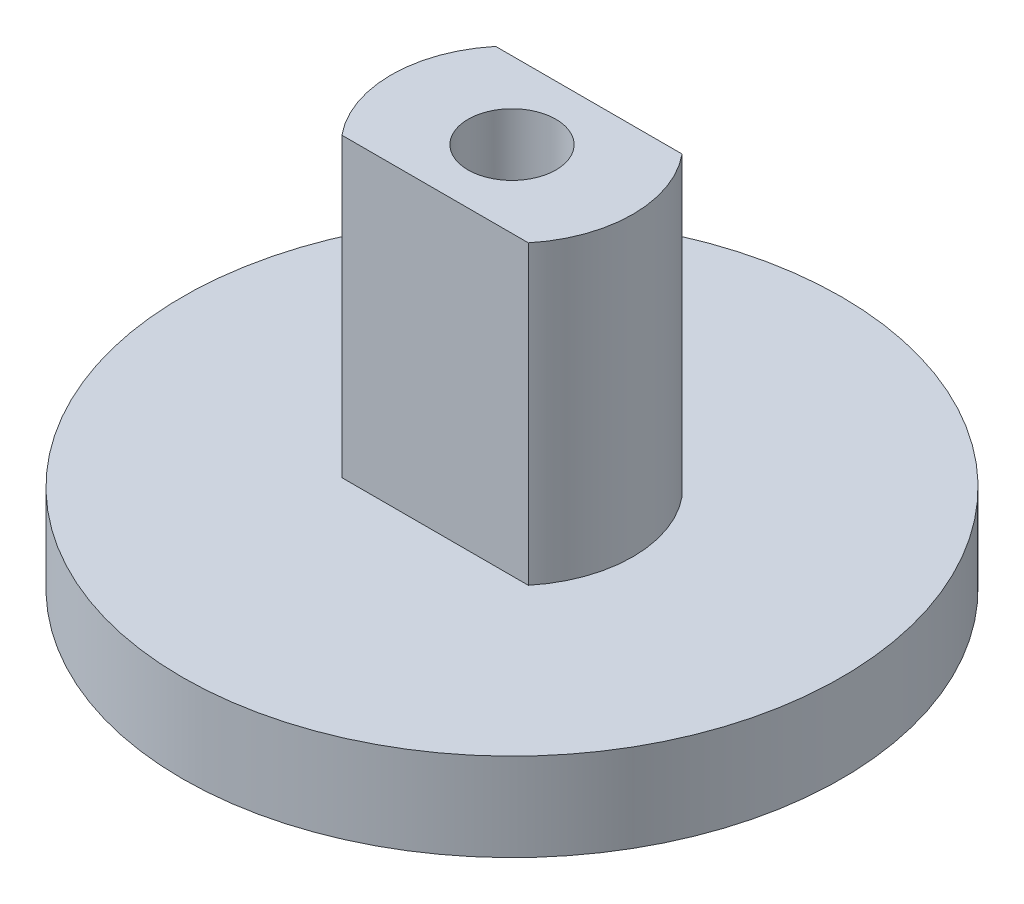
ISO-10303-21;
HEADER;
FILE_DESCRIPTION(('STEP AP214'),'2;1');
FILE_NAME('part.step','',(''),(''),'','','');
FILE_SCHEMA(('AUTOMOTIVE_DESIGN { 1 0 10303 214 1 1 1 1 }'));
ENDSEC;
DATA;
#1=APPLICATION_CONTEXT('core data for automotive mechanical design processes');
#2=APPLICATION_PROTOCOL_DEFINITION('international standard','automotive_design',2000,#1);
#3=PRODUCT_CONTEXT('',#1,'mechanical');
#4=PRODUCT('Part','Part','',(#3));
#5=PRODUCT_RELATED_PRODUCT_CATEGORY('part','',(#4));
#6=PRODUCT_DEFINITION_FORMATION('','',#4);
#7=PRODUCT_DEFINITION_CONTEXT('part definition',#1,'design');
#8=PRODUCT_DEFINITION('design','',#6,#7);
#9=PRODUCT_DEFINITION_SHAPE('','',#8);
#10=(LENGTH_UNIT() NAMED_UNIT(*) SI_UNIT(.MILLI.,.METRE.));
#11=(NAMED_UNIT(*) PLANE_ANGLE_UNIT() SI_UNIT($,.RADIAN.));
#12=(NAMED_UNIT(*) SI_UNIT($,.STERADIAN.) SOLID_ANGLE_UNIT());
#13=UNCERTAINTY_MEASURE_WITH_UNIT(LENGTH_MEASURE(1.E-05),#10,'distance_accuracy_value','');
#14=(GEOMETRIC_REPRESENTATION_CONTEXT(3) GLOBAL_UNCERTAINTY_ASSIGNED_CONTEXT((#13)) GLOBAL_UNIT_ASSIGNED_CONTEXT((#10,
#11,#12)) REPRESENTATION_CONTEXT('',''));
#15=CARTESIAN_POINT('',(0.,0.,0.));
#16=DIRECTION('',(0.,0.,1.));
#17=DIRECTION('',(1.,0.,0.));
#18=AXIS2_PLACEMENT_3D('',#15,#16,#17);
#19=CARTESIAN_POINT('',(0.,-6.,0.));
#20=DIRECTION('',(0.,1.,0.));
#21=DIRECTION('',(0.,0.,1.));
#22=AXIS2_PLACEMENT_3D('',#19,#20,#21);
#23=CYLINDRICAL_SURFACE('',#22,1.);
#24=CARTESIAN_POINT('',(0.,17.,0.));
#25=DIRECTION('',(0.,1.,0.));
#26=DIRECTION('',(0.,0.,1.));
#27=AXIS2_PLACEMENT_3D('',#24,#25,#26);
#28=CIRCLE('',#27,1.);
#29=CARTESIAN_POINT('',(0.,17.,1.));
#30=VERTEX_POINT('',#29);
#31=EDGE_CURVE('E99',#30,#30,#28,.F.);
#32=ORIENTED_EDGE('',*,*,#31,.T.);
#33=EDGE_LOOP('',(#32));
#34=FACE_BOUND('',#33,.T.);
#35=CARTESIAN_POINT('',(0.,24.,0.));
#36=DIRECTION('',(0.,-1.,0.));
#37=DIRECTION('',(0.,0.,-1.));
#38=AXIS2_PLACEMENT_3D('',#35,#36,#37);
#39=CIRCLE('',#38,1.);
#40=CARTESIAN_POINT('',(0.,24.,-1.));
#41=VERTEX_POINT('',#40);
#42=EDGE_CURVE('E102',#41,#41,#39,.T.);
#43=ORIENTED_EDGE('',*,*,#42,.F.);
#44=EDGE_LOOP('',(#43));
#45=FACE_BOUND('',#44,.T.);
#46=ADVANCED_FACE('F33',(#34,#45),#23,.F.);
#47=CARTESIAN_POINT('',(0.,24.,0.));
#48=DIRECTION('',(0.,-1.,0.));
#49=DIRECTION('',(0.,0.,-1.));
#50=AXIS2_PLACEMENT_3D('',#47,#48,#49);
#51=CYLINDRICAL_SURFACE('',#50,2.75000000000005);
#52=DIRECTION('',(0.,-1.,0.));
#53=VECTOR('',#52,1.);
#54=CARTESIAN_POINT('',(-2.12132034355971,24.,-1.75));
#55=LINE('',#54,#53);
#56=CARTESIAN_POINT('',(-2.12132034355971,24.,-1.75));
#57=VERTEX_POINT('',#56);
#58=CARTESIAN_POINT('',(-2.12132034355971,17.25,-1.75));
#59=VERTEX_POINT('',#58);
#60=EDGE_CURVE('E37',#57,#59,#55,.T.);
#61=ORIENTED_EDGE('',*,*,#60,.T.);
#62=CARTESIAN_POINT('',(0.,17.25,0.));
#63=DIRECTION('',(0.,1.,0.));
#64=DIRECTION('',(0.,0.,1.));
#65=AXIS2_PLACEMENT_3D('',#62,#63,#64);
#66=CIRCLE('',#65,2.75000000000005);
#67=CARTESIAN_POINT('',(-2.12132034355971,17.25,1.75));
#68=VERTEX_POINT('',#67);
#69=EDGE_CURVE('E79',#68,#59,#66,.F.);
#70=ORIENTED_EDGE('',*,*,#69,.F.);
#71=DIRECTION('',(0.,-1.,0.));
#72=VECTOR('',#71,1.);
#73=CARTESIAN_POINT('',(-2.12132034355971,24.,1.75));
#74=LINE('',#73,#72);
#75=CARTESIAN_POINT('',(-2.12132034355971,24.,1.75));
#76=VERTEX_POINT('',#75);
#77=EDGE_CURVE('E11',#76,#68,#74,.T.);
#78=ORIENTED_EDGE('',*,*,#77,.F.);
#79=CARTESIAN_POINT('',(0.,24.,0.));
#80=DIRECTION('',(0.,-1.,0.));
#81=DIRECTION('',(0.,0.,-1.));
#82=AXIS2_PLACEMENT_3D('',#79,#80,#81);
#83=CIRCLE('',#82,2.75000000000005);
#84=EDGE_CURVE('E105',#76,#57,#83,.T.);
#85=ORIENTED_EDGE('',*,*,#84,.T.);
#86=EDGE_LOOP('',(#61,#70,#78,#85));
#87=FACE_BOUND('',#86,.T.);
#88=ADVANCED_FACE('F80',(#87),#51,.T.);
#89=CARTESIAN_POINT('',(2.12132034355971,24.,1.75));
#90=DIRECTION('',(0.,0.,1.));
#91=DIRECTION('',(1.,0.,0.));
#92=AXIS2_PLACEMENT_3D('',#89,#90,#91);
#93=PLANE('',#92);
#94=ORIENTED_EDGE('',*,*,#77,.T.);
#95=DIRECTION('',(-1.,0.,0.));
#96=VECTOR('',#95,1.);
#97=CARTESIAN_POINT('',(0.,17.25,1.75));
#98=LINE('',#97,#96);
#99=CARTESIAN_POINT('',(2.12132034355971,17.25,1.75));
#100=VERTEX_POINT('',#99);
#101=EDGE_CURVE('E74',#100,#68,#98,.T.);
#102=ORIENTED_EDGE('',*,*,#101,.F.);
#103=DIRECTION('',(0.,-1.,0.));
#104=VECTOR('',#103,1.);
#105=CARTESIAN_POINT('',(2.12132034355971,24.,1.75));
#106=LINE('',#105,#104);
#107=CARTESIAN_POINT('',(2.12132034355971,24.,1.75));
#108=VERTEX_POINT('',#107);
#109=EDGE_CURVE('E42',#108,#100,#106,.T.);
#110=ORIENTED_EDGE('',*,*,#109,.F.);
#111=DIRECTION('',(-1.,0.,0.));
#112=VECTOR('',#111,1.);
#113=CARTESIAN_POINT('',(2.12132034355971,24.,1.75));
#114=LINE('',#113,#112);
#115=EDGE_CURVE('E77',#108,#76,#114,.T.);
#116=ORIENTED_EDGE('',*,*,#115,.T.);
#117=EDGE_LOOP('',(#94,#102,#110,#116));
#118=FACE_BOUND('',#117,.T.);
#119=ADVANCED_FACE('F72',(#118),#93,.T.);
#120=CARTESIAN_POINT('',(0.,24.,0.));
#121=DIRECTION('',(0.,-1.,0.));
#122=DIRECTION('',(0.,0.,-1.));
#123=AXIS2_PLACEMENT_3D('',#120,#121,#122);
#124=CYLINDRICAL_SURFACE('',#123,2.75000000000005);
#125=ORIENTED_EDGE('',*,*,#109,.T.);
#126=CARTESIAN_POINT('',(0.,17.25,0.));
#127=DIRECTION('',(0.,1.,0.));
#128=DIRECTION('',(0.,0.,1.));
#129=AXIS2_PLACEMENT_3D('',#126,#127,#128);
#130=CIRCLE('',#129,2.75000000000005);
#131=CARTESIAN_POINT('',(2.12132034355971,17.25,-1.75));
#132=VERTEX_POINT('',#131);
#133=EDGE_CURVE('E88',#132,#100,#130,.F.);
#134=ORIENTED_EDGE('',*,*,#133,.F.);
#135=DIRECTION('',(0.,-1.,0.));
#136=VECTOR('',#135,1.);
#137=CARTESIAN_POINT('',(2.12132034355971,24.,-1.75));
#138=LINE('',#137,#136);
#139=CARTESIAN_POINT('',(2.12132034355971,24.,-1.75));
#140=VERTEX_POINT('',#139);
#141=EDGE_CURVE('E113',#140,#132,#138,.T.);
#142=ORIENTED_EDGE('',*,*,#141,.F.);
#143=CARTESIAN_POINT('',(0.,24.,0.));
#144=DIRECTION('',(0.,-1.,0.));
#145=DIRECTION('',(0.,0.,-1.));
#146=AXIS2_PLACEMENT_3D('',#143,#144,#145);
#147=CIRCLE('',#146,2.75000000000005);
#148=EDGE_CURVE('E110',#140,#108,#147,.T.);
#149=ORIENTED_EDGE('',*,*,#148,.T.);
#150=EDGE_LOOP('',(#125,#134,#142,#149));
#151=FACE_BOUND('',#150,.T.);
#152=ADVANCED_FACE('F119',(#151),#124,.T.);
#153=CARTESIAN_POINT('',(-2.12132034355971,24.,-1.75));
#154=DIRECTION('',(0.,0.,-1.));
#155=DIRECTION('',(-1.,0.,0.));
#156=AXIS2_PLACEMENT_3D('',#153,#154,#155);
#157=PLANE('',#156);
#158=ORIENTED_EDGE('',*,*,#141,.T.);
#159=DIRECTION('',(1.,0.,0.));
#160=VECTOR('',#159,1.);
#161=CARTESIAN_POINT('',(0.,17.25,-1.75));
#162=LINE('',#161,#160);
#163=EDGE_CURVE('E84',#59,#132,#162,.T.);
#164=ORIENTED_EDGE('',*,*,#163,.F.);
#165=ORIENTED_EDGE('',*,*,#60,.F.);
#166=DIRECTION('',(1.,0.,0.));
#167=VECTOR('',#166,1.);
#168=CARTESIAN_POINT('',(-2.12132034355971,24.,-1.75));
#169=LINE('',#168,#167);
#170=EDGE_CURVE('E107',#57,#140,#169,.T.);
#171=ORIENTED_EDGE('',*,*,#170,.T.);
#172=EDGE_LOOP('',(#158,#164,#165,#171));
#173=FACE_BOUND('',#172,.T.);
#174=ADVANCED_FACE('F115',(#173),#157,.T.);
#175=CARTESIAN_POINT('',(0.,24.,0.));
#176=DIRECTION('',(0.,-1.,0.));
#177=DIRECTION('',(0.,0.,-1.));
#178=AXIS2_PLACEMENT_3D('',#175,#176,#177);
#179=PLANE('',#178);
#180=ORIENTED_EDGE('',*,*,#42,.T.);
#181=EDGE_LOOP('',(#180));
#182=FACE_BOUND('',#181,.T.);
#183=ORIENTED_EDGE('',*,*,#84,.F.);
#184=ORIENTED_EDGE('',*,*,#115,.F.);
#185=ORIENTED_EDGE('',*,*,#148,.F.);
#186=ORIENTED_EDGE('',*,*,#170,.F.);
#187=EDGE_LOOP('',(#183,#184,#185,#186));
#188=FACE_BOUND('',#187,.T.);
#189=ADVANCED_FACE('F121',(#182,#188),#179,.F.);
#190=CARTESIAN_POINT('',(0.,17.,0.));
#191=DIRECTION('',(0.,-1.,0.));
#192=DIRECTION('',(0.,0.,-1.));
#193=AXIS2_PLACEMENT_3D('',#190,#191,#192);
#194=PLANE('',#193);
#195=ORIENTED_EDGE('',*,*,#31,.F.);
#196=EDGE_LOOP('',(#195));
#197=FACE_BOUND('',#196,.T.);
#198=ADVANCED_FACE('F123',(#197),#194,.F.);
#199=CARTESIAN_POINT('',(0.,17.25,0.));
#200=DIRECTION('',(0.,1.,0.));
#201=DIRECTION('',(0.,0.,1.));
#202=AXIS2_PLACEMENT_3D('',#199,#200,#201);
#203=PLANE('',#202);
#204=CARTESIAN_POINT('',(0.,17.25,0.));
#205=DIRECTION('',(0.,1.,0.));
#206=DIRECTION('',(0.,0.,1.));
#207=AXIS2_PLACEMENT_3D('',#204,#205,#206);
#208=CIRCLE('',#207,7.5);
#209=CARTESIAN_POINT('',(0.,17.25,7.5));
#210=VERTEX_POINT('',#209);
#211=EDGE_CURVE('E89',#210,#210,#208,.T.);
#212=ORIENTED_EDGE('',*,*,#211,.T.);
#213=EDGE_LOOP('',(#212));
#214=FACE_BOUND('',#213,.T.);
#215=ORIENTED_EDGE('',*,*,#101,.T.);
#216=ORIENTED_EDGE('',*,*,#69,.T.);
#217=ORIENTED_EDGE('',*,*,#163,.T.);
#218=ORIENTED_EDGE('',*,*,#133,.T.);
#219=EDGE_LOOP('',(#215,#216,#217,#218));
#220=FACE_BOUND('',#219,.T.);
#221=ADVANCED_FACE('F86',(#214,#220),#203,.T.);
#222=CARTESIAN_POINT('',(0.,15.25,0.));
#223=DIRECTION('',(0.,-1.,0.));
#224=DIRECTION('',(0.,0.,-1.));
#225=AXIS2_PLACEMENT_3D('',#222,#223,#224);
#226=PLANE('',#225);
#227=CARTESIAN_POINT('',(0.,15.25,0.));
#228=DIRECTION('',(0.,-1.,0.));
#229=DIRECTION('',(0.,0.,-1.));
#230=AXIS2_PLACEMENT_3D('',#227,#228,#229);
#231=CIRCLE('',#230,7.5);
#232=CARTESIAN_POINT('',(0.,15.25,-7.5));
#233=VERTEX_POINT('',#232);
#234=EDGE_CURVE('E96',#233,#233,#231,.T.);
#235=ORIENTED_EDGE('',*,*,#234,.T.);
#236=EDGE_LOOP('',(#235));
#237=FACE_BOUND('',#236,.T.);
#238=ADVANCED_FACE('F167',(#237),#226,.T.);
#239=CARTESIAN_POINT('',(0.,19.,0.));
#240=DIRECTION('',(0.,-1.,0.));
#241=DIRECTION('',(0.,0.,-1.));
#242=AXIS2_PLACEMENT_3D('',#239,#240,#241);
#243=CYLINDRICAL_SURFACE('',#242,7.5);
#244=ORIENTED_EDGE('',*,*,#234,.F.);
#245=EDGE_LOOP('',(#244));
#246=FACE_BOUND('',#245,.T.);
#247=ORIENTED_EDGE('',*,*,#211,.F.);
#248=EDGE_LOOP('',(#247));
#249=FACE_BOUND('',#248,.T.);
#250=ADVANCED_FACE('F35',(#246,#249),#243,.T.);
#251=CLOSED_SHELL('',(#46,#88,#119,#152,#174,#189,#198,#221,#238,#250));
#252=MANIFOLD_SOLID_BREP('B2',#251);
#253=ADVANCED_BREP_SHAPE_REPRESENTATION('',(#18,#252),#14);
#254=SHAPE_DEFINITION_REPRESENTATION(#9,#253);
ENDSEC;
END-ISO-10303-21;
